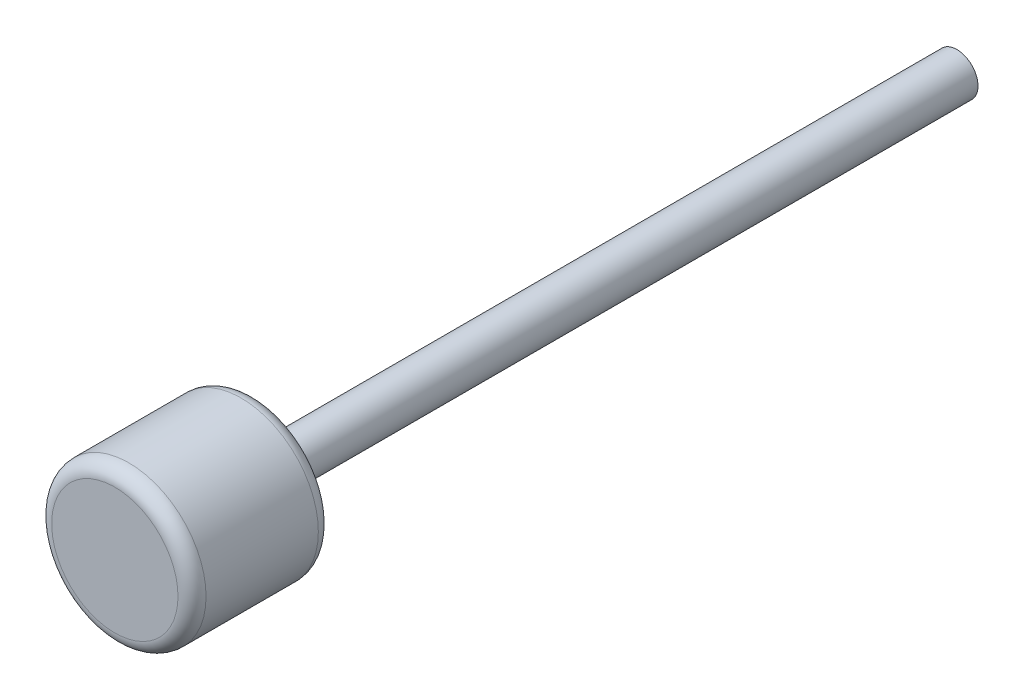
ISO-10303-21;
HEADER;
FILE_DESCRIPTION(('STEP AP214'),'2;1');
FILE_NAME('part.step','',(''),(''),'','','');
FILE_SCHEMA(('AUTOMOTIVE_DESIGN { 1 0 10303 214 1 1 1 1 }'));
ENDSEC;
DATA;
#1=APPLICATION_CONTEXT('core data for automotive mechanical design processes');
#2=APPLICATION_PROTOCOL_DEFINITION('international standard','automotive_design',2000,#1);
#3=PRODUCT_CONTEXT('',#1,'mechanical');
#4=PRODUCT('Part','Part','',(#3));
#5=PRODUCT_RELATED_PRODUCT_CATEGORY('part','',(#4));
#6=PRODUCT_DEFINITION_FORMATION('','',#4);
#7=PRODUCT_DEFINITION_CONTEXT('part definition',#1,'design');
#8=PRODUCT_DEFINITION('design','',#6,#7);
#9=PRODUCT_DEFINITION_SHAPE('','',#8);
#10=(LENGTH_UNIT() NAMED_UNIT(*) SI_UNIT(.MILLI.,.METRE.));
#11=(NAMED_UNIT(*) PLANE_ANGLE_UNIT() SI_UNIT($,.RADIAN.));
#12=(NAMED_UNIT(*) SI_UNIT($,.STERADIAN.) SOLID_ANGLE_UNIT());
#13=UNCERTAINTY_MEASURE_WITH_UNIT(LENGTH_MEASURE(1.E-05),#10,'distance_accuracy_value','');
#14=(GEOMETRIC_REPRESENTATION_CONTEXT(3) GLOBAL_UNCERTAINTY_ASSIGNED_CONTEXT((#13)) GLOBAL_UNIT_ASSIGNED_CONTEXT((#10,
#11,#12)) REPRESENTATION_CONTEXT('',''));
#15=CARTESIAN_POINT('',(0.,0.,0.));
#16=DIRECTION('',(0.,0.,1.));
#17=DIRECTION('',(1.,0.,0.));
#18=AXIS2_PLACEMENT_3D('',#15,#16,#17);
#19=CARTESIAN_POINT('',(0.,12.0208152801712,50.));
#20=DIRECTION('',(0.,0.,-1.));
#21=DIRECTION('',(-1.,0.,0.));
#22=AXIS2_PLACEMENT_3D('',#19,#20,#21);
#23=CYLINDRICAL_SURFACE('',#22,1.5);
#24=CARTESIAN_POINT('',(0.,12.0208152801712,50.));
#25=DIRECTION('',(0.,0.,1.));
#26=DIRECTION('',(1.,0.,0.));
#27=AXIS2_PLACEMENT_3D('',#24,#25,#26);
#28=CIRCLE('',#27,1.5);
#29=CARTESIAN_POINT('',(1.5,12.0208152801712,50.));
#30=VERTEX_POINT('',#29);
#31=EDGE_CURVE('E51',#30,#30,#28,.T.);
#32=ORIENTED_EDGE('',*,*,#31,.F.);
#33=EDGE_LOOP('',(#32));
#34=FACE_BOUND('',#33,.T.);
#35=CARTESIAN_POINT('',(0.,12.0208152801712,0.));
#36=DIRECTION('',(0.,0.,1.));
#37=DIRECTION('',(1.,0.,0.));
#38=AXIS2_PLACEMENT_3D('',#35,#36,#37);
#39=CIRCLE('',#38,1.5);
#40=CARTESIAN_POINT('',(1.5,12.0208152801712,0.));
#41=VERTEX_POINT('',#40);
#42=EDGE_CURVE('E52',#41,#41,#39,.T.);
#43=ORIENTED_EDGE('',*,*,#42,.T.);
#44=EDGE_LOOP('',(#43));
#45=FACE_BOUND('',#44,.T.);
#46=ADVANCED_FACE('F31',(#34,#45),#23,.T.);
#47=CARTESIAN_POINT('',(0.,12.0208152801712,0.));
#48=DIRECTION('',(0.,0.,1.));
#49=DIRECTION('',(1.,0.,0.));
#50=AXIS2_PLACEMENT_3D('',#47,#48,#49);
#51=PLANE('',#50);
#52=ORIENTED_EDGE('',*,*,#42,.F.);
#53=EDGE_LOOP('',(#52));
#54=FACE_BOUND('',#53,.T.);
#55=ADVANCED_FACE('F62',(#54),#51,.F.);
#56=CARTESIAN_POINT('',(0.,12.0208152801712,60.));
#57=DIRECTION('',(0.,0.,-1.));
#58=DIRECTION('',(-1.,0.,0.));
#59=AXIS2_PLACEMENT_3D('',#56,#57,#58);
#60=CYLINDRICAL_SURFACE('',#59,5.5);
#61=CARTESIAN_POINT('',(0.,12.0208152801712,51.));
#62=DIRECTION('',(0.,0.,1.));
#63=DIRECTION('',(1.,0.,0.));
#64=AXIS2_PLACEMENT_3D('',#61,#62,#63);
#65=CIRCLE('',#64,5.5);
#66=CARTESIAN_POINT('',(5.5,12.0208152801712,51.));
#67=VERTEX_POINT('',#66);
#68=EDGE_CURVE('E42',#67,#67,#65,.T.);
#69=ORIENTED_EDGE('',*,*,#68,.T.);
#70=EDGE_LOOP('',(#69));
#71=FACE_BOUND('',#70,.T.);
#72=CARTESIAN_POINT('',(0.,12.0208152801712,59.));
#73=DIRECTION('',(0.,0.,1.));
#74=DIRECTION('',(1.,0.,0.));
#75=AXIS2_PLACEMENT_3D('',#72,#73,#74);
#76=CIRCLE('',#75,5.5);
#77=CARTESIAN_POINT('',(5.5,12.0208152801712,59.));
#78=VERTEX_POINT('',#77);
#79=EDGE_CURVE('E46',#78,#78,#76,.F.);
#80=ORIENTED_EDGE('',*,*,#79,.T.);
#81=EDGE_LOOP('',(#80));
#82=FACE_BOUND('',#81,.T.);
#83=ADVANCED_FACE('F67',(#71,#82),#60,.T.);
#84=CARTESIAN_POINT('',(0.,12.0208152801712,60.));
#85=DIRECTION('',(0.,0.,1.));
#86=DIRECTION('',(1.,0.,0.));
#87=AXIS2_PLACEMENT_3D('',#84,#85,#86);
#88=PLANE('',#87);
#89=CARTESIAN_POINT('',(0.,12.0208152801712,60.));
#90=DIRECTION('',(0.,0.,1.));
#91=DIRECTION('',(1.,0.,0.));
#92=AXIS2_PLACEMENT_3D('',#89,#90,#91);
#93=CIRCLE('',#92,4.5);
#94=CARTESIAN_POINT('',(4.5,12.0208152801712,60.));
#95=VERTEX_POINT('',#94);
#96=EDGE_CURVE('E10',#95,#95,#93,.T.);
#97=ORIENTED_EDGE('',*,*,#96,.T.);
#98=EDGE_LOOP('',(#97));
#99=FACE_BOUND('',#98,.T.);
#100=ADVANCED_FACE('F72',(#99),#88,.T.);
#101=CARTESIAN_POINT('',(0.,12.0208152801712,50.));
#102=DIRECTION('',(0.,0.,1.));
#103=DIRECTION('',(1.,0.,0.));
#104=AXIS2_PLACEMENT_3D('',#101,#102,#103);
#105=PLANE('',#104);
#106=CARTESIAN_POINT('',(0.,12.0208152801712,50.));
#107=DIRECTION('',(0.,0.,1.));
#108=DIRECTION('',(1.,0.,0.));
#109=AXIS2_PLACEMENT_3D('',#106,#107,#108);
#110=CIRCLE('',#109,4.5);
#111=CARTESIAN_POINT('',(4.5,12.0208152801712,50.));
#112=VERTEX_POINT('',#111);
#113=EDGE_CURVE('E38',#112,#112,#110,.F.);
#114=ORIENTED_EDGE('',*,*,#113,.T.);
#115=EDGE_LOOP('',(#114));
#116=FACE_BOUND('',#115,.T.);
#117=ORIENTED_EDGE('',*,*,#31,.T.);
#118=EDGE_LOOP('',(#117));
#119=FACE_BOUND('',#118,.T.);
#120=ADVANCED_FACE('F58',(#116,#119),#105,.F.);
#121=CARTESIAN_POINT('',(0.,12.0208152801712,51.));
#122=DIRECTION('',(0.,0.,1.));
#123=DIRECTION('',(1.,0.,0.));
#124=AXIS2_PLACEMENT_3D('',#121,#122,#123);
#125=TOROIDAL_SURFACE('',#124,4.5,1.);
#126=ORIENTED_EDGE('',*,*,#113,.F.);
#127=EDGE_LOOP('',(#126));
#128=FACE_BOUND('',#127,.T.);
#129=ORIENTED_EDGE('',*,*,#68,.F.);
#130=EDGE_LOOP('',(#129));
#131=FACE_BOUND('',#130,.T.);
#132=ADVANCED_FACE('F76',(#128,#131),#125,.T.);
#133=CARTESIAN_POINT('',(0.,12.0208152801712,59.));
#134=DIRECTION('',(0.,0.,1.));
#135=DIRECTION('',(1.,0.,0.));
#136=AXIS2_PLACEMENT_3D('',#133,#134,#135);
#137=TOROIDAL_SURFACE('',#136,4.5,1.);
#138=ORIENTED_EDGE('',*,*,#79,.F.);
#139=EDGE_LOOP('',(#138));
#140=FACE_BOUND('',#139,.T.);
#141=ORIENTED_EDGE('',*,*,#96,.F.);
#142=EDGE_LOOP('',(#141));
#143=FACE_BOUND('',#142,.T.);
#144=ADVANCED_FACE('F33',(#140,#143),#137,.T.);
#145=CLOSED_SHELL('',(#46,#55,#83,#100,#120,#132,#144));
#146=MANIFOLD_SOLID_BREP('B2',#145);
#147=ADVANCED_BREP_SHAPE_REPRESENTATION('',(#18,#146),#14);
#148=SHAPE_DEFINITION_REPRESENTATION(#9,#147);
ENDSEC;
END-ISO-10303-21;
